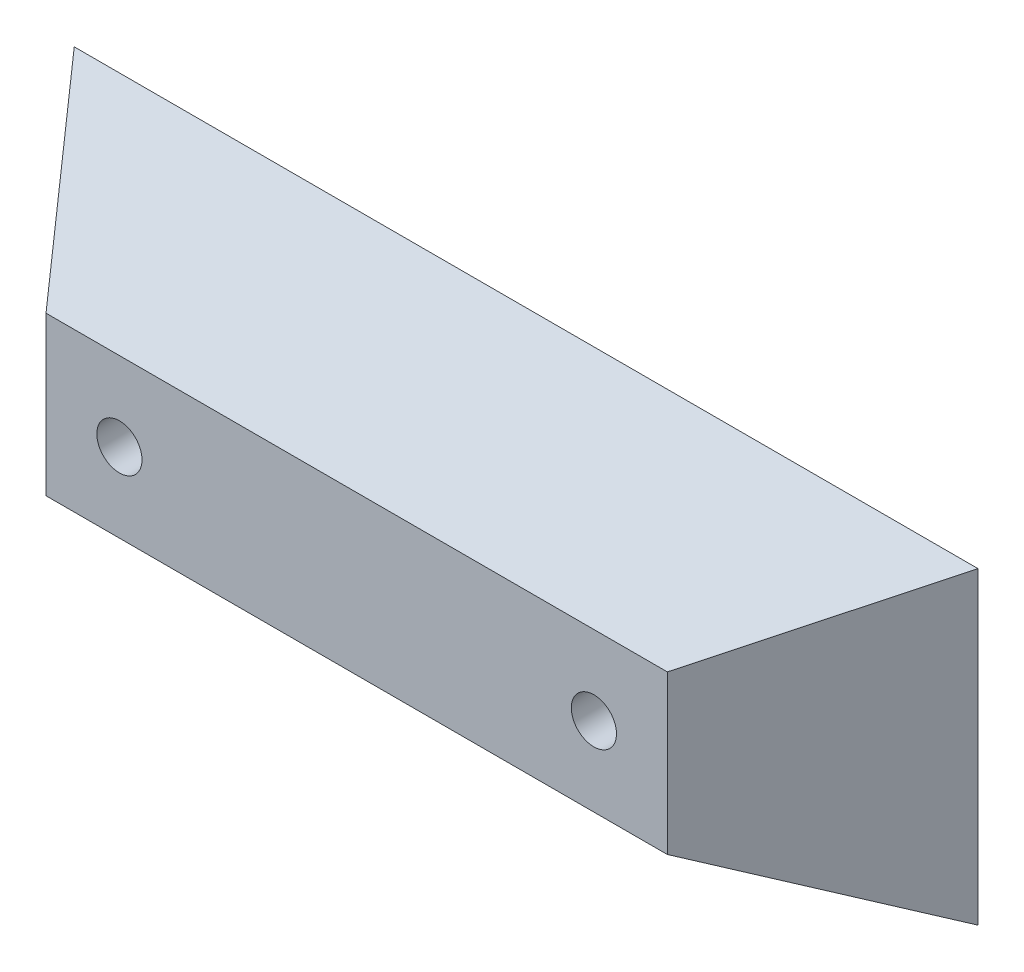
ISO-10303-21;
HEADER;
FILE_DESCRIPTION(('STEP AP214'),'2;1');
FILE_NAME('part.step','',(''),(''),'','','');
FILE_SCHEMA(('AUTOMOTIVE_DESIGN { 1 0 10303 214 1 1 1 1 }'));
ENDSEC;
DATA;
#1=APPLICATION_CONTEXT('core data for automotive mechanical design processes');
#2=APPLICATION_PROTOCOL_DEFINITION('international standard','automotive_design',2000,#1);
#3=PRODUCT_CONTEXT('',#1,'mechanical');
#4=PRODUCT('Part','Part','',(#3));
#5=PRODUCT_RELATED_PRODUCT_CATEGORY('part','',(#4));
#6=PRODUCT_DEFINITION_FORMATION('','',#4);
#7=PRODUCT_DEFINITION_CONTEXT('part definition',#1,'design');
#8=PRODUCT_DEFINITION('design','',#6,#7);
#9=PRODUCT_DEFINITION_SHAPE('','',#8);
#10=(LENGTH_UNIT() NAMED_UNIT(*) SI_UNIT(.MILLI.,.METRE.));
#11=(NAMED_UNIT(*) PLANE_ANGLE_UNIT() SI_UNIT($,.RADIAN.));
#12=(NAMED_UNIT(*) SI_UNIT($,.STERADIAN.) SOLID_ANGLE_UNIT());
#13=UNCERTAINTY_MEASURE_WITH_UNIT(LENGTH_MEASURE(1.E-05),#10,'distance_accuracy_value','');
#14=(GEOMETRIC_REPRESENTATION_CONTEXT(3) GLOBAL_UNCERTAINTY_ASSIGNED_CONTEXT((#13)) GLOBAL_UNIT_ASSIGNED_CONTEXT((#10,
#11,#12)) REPRESENTATION_CONTEXT('',''));
#15=CARTESIAN_POINT('',(0.,0.,0.));
#16=DIRECTION('',(0.,0.,1.));
#17=DIRECTION('',(1.,0.,0.));
#18=AXIS2_PLACEMENT_3D('',#15,#16,#17);
#19=CARTESIAN_POINT('',(40.,30.,0.));
#20=DIRECTION('',(0.,0.,1.));
#21=DIRECTION('',(1.,0.,0.));
#22=AXIS2_PLACEMENT_3D('',#19,#20,#21);
#23=PLANE('',#22);
#24=CARTESIAN_POINT('',(21.,15.,0.));
#25=DIRECTION('',(0.,0.,-1.));
#26=DIRECTION('',(-1.,0.,0.));
#27=AXIS2_PLACEMENT_3D('',#24,#25,#26);
#28=CIRCLE('',#27,2.);
#29=CARTESIAN_POINT('',(19.,15.,0.));
#30=VERTEX_POINT('',#29);
#31=EDGE_CURVE('E131',#30,#30,#28,.T.);
#32=ORIENTED_EDGE('',*,*,#31,.F.);
#33=EDGE_LOOP('',(#32));
#34=FACE_BOUND('',#33,.T.);
#35=CARTESIAN_POINT('',(-21.,15.,0.));
#36=DIRECTION('',(0.,0.,-1.));
#37=DIRECTION('',(-1.,0.,0.));
#38=AXIS2_PLACEMENT_3D('',#35,#36,#37);
#39=CIRCLE('',#38,2.00000000000001);
#40=CARTESIAN_POINT('',(-23.,15.,0.));
#41=VERTEX_POINT('',#40);
#42=EDGE_CURVE('E132',#41,#41,#39,.T.);
#43=ORIENTED_EDGE('',*,*,#42,.F.);
#44=EDGE_LOOP('',(#43));
#45=FACE_BOUND('',#44,.T.);
#46=DIRECTION('',(0.,-1.,0.));
#47=VECTOR('',#46,1.);
#48=CARTESIAN_POINT('',(-40.,30.,0.));
#49=LINE('',#48,#47);
#50=CARTESIAN_POINT('',(-40.,28.6666666666667,0.));
#51=VERTEX_POINT('',#50);
#52=CARTESIAN_POINT('',(-40.,1.33333333333334,0.));
#53=VERTEX_POINT('',#52);
#54=EDGE_CURVE('E103',#51,#53,#49,.T.);
#55=ORIENTED_EDGE('',*,*,#54,.F.);
#56=DIRECTION('',(1.,0.,0.));
#57=VECTOR('',#56,1.);
#58=CARTESIAN_POINT('',(0.,28.6666666666667,0.));
#59=LINE('',#58,#57);
#60=CARTESIAN_POINT('',(40.,28.6666666666667,0.));
#61=VERTEX_POINT('',#60);
#62=EDGE_CURVE('E114',#51,#61,#59,.T.);
#63=ORIENTED_EDGE('',*,*,#62,.T.);
#64=DIRECTION('',(0.,-1.,0.));
#65=VECTOR('',#64,1.);
#66=CARTESIAN_POINT('',(40.,30.,0.));
#67=LINE('',#66,#65);
#68=CARTESIAN_POINT('',(40.,1.33333333333334,0.));
#69=VERTEX_POINT('',#68);
#70=EDGE_CURVE('E88',#61,#69,#67,.T.);
#71=ORIENTED_EDGE('',*,*,#70,.T.);
#72=DIRECTION('',(1.,0.,0.));
#73=VECTOR('',#72,1.);
#74=CARTESIAN_POINT('',(-27.5,1.33333333333333,0.));
#75=LINE('',#74,#73);
#76=EDGE_CURVE('E96',#69,#53,#75,.F.);
#77=ORIENTED_EDGE('',*,*,#76,.T.);
#78=EDGE_LOOP('',(#55,#63,#71,#77));
#79=FACE_BOUND('',#78,.T.);
#80=ADVANCED_FACE('F39',(#34,#45,#79),#23,.F.);
#81=CARTESIAN_POINT('',(-40.,30.,0.));
#82=DIRECTION('',(0.768221279597376,0.,-0.64018439966448));
#83=DIRECTION('',(-0.64018439966448,0.,-0.768221279597376));
#84=AXIS2_PLACEMENT_3D('',#81,#82,#83);
#85=PLANE('',#84);
#86=DIRECTION('',(0.,-1.,0.));
#87=VECTOR('',#86,1.);
#88=CARTESIAN_POINT('',(-27.5,30.,15.));
#89=LINE('',#88,#87);
#90=CARTESIAN_POINT('',(-27.5,22.,15.));
#91=VERTEX_POINT('',#90);
#92=CARTESIAN_POINT('',(-27.5,8.,15.));
#93=VERTEX_POINT('',#92);
#94=EDGE_CURVE('E87',#91,#93,#89,.T.);
#95=ORIENTED_EDGE('',*,*,#94,.F.);
#96=DIRECTION('',(-0.605844293791514,0.323116956688808,-0.727013152549817));
#97=VECTOR('',#96,1.);
#98=CARTESIAN_POINT('',(-26.9004893964111,21.6802610114192,15.7194127243067));
#99=LINE('',#98,#97);
#100=EDGE_CURVE('E11',#91,#51,#99,.T.);
#101=ORIENTED_EDGE('',*,*,#100,.T.);
#102=ORIENTED_EDGE('',*,*,#54,.T.);
#103=DIRECTION('',(-0.605844293791514,-0.323116956688808,-0.727013152549817));
#104=VECTOR('',#103,1.);
#105=CARTESIAN_POINT('',(-27.5,8.,15.));
#106=LINE('',#105,#104);
#107=EDGE_CURVE('E111',#53,#93,#106,.F.);
#108=ORIENTED_EDGE('',*,*,#107,.T.);
#109=EDGE_LOOP('',(#95,#101,#102,#108));
#110=FACE_BOUND('',#109,.T.);
#111=ADVANCED_FACE('F120',(#110),#85,.F.);
#112=CARTESIAN_POINT('',(-27.5,30.,15.));
#113=DIRECTION('',(0.,0.,-1.));
#114=DIRECTION('',(-1.,0.,0.));
#115=AXIS2_PLACEMENT_3D('',#112,#113,#114);
#116=PLANE('',#115);
#117=CARTESIAN_POINT('',(21.,15.,15.));
#118=DIRECTION('',(0.,0.,-1.));
#119=DIRECTION('',(-1.,0.,0.));
#120=AXIS2_PLACEMENT_3D('',#117,#118,#119);
#121=CIRCLE('',#120,2.);
#122=CARTESIAN_POINT('',(19.,15.,15.));
#123=VERTEX_POINT('',#122);
#124=EDGE_CURVE('E126',#123,#123,#121,.F.);
#125=ORIENTED_EDGE('',*,*,#124,.F.);
#126=EDGE_LOOP('',(#125));
#127=FACE_BOUND('',#126,.T.);
#128=CARTESIAN_POINT('',(-21.,15.,15.));
#129=DIRECTION('',(0.,0.,-1.));
#130=DIRECTION('',(-1.,0.,0.));
#131=AXIS2_PLACEMENT_3D('',#128,#129,#130);
#132=CIRCLE('',#131,2.00000000000001);
#133=CARTESIAN_POINT('',(-23.,15.,15.));
#134=VERTEX_POINT('',#133);
#135=EDGE_CURVE('E127',#134,#134,#132,.F.);
#136=ORIENTED_EDGE('',*,*,#135,.F.);
#137=EDGE_LOOP('',(#136));
#138=FACE_BOUND('',#137,.T.);
#139=DIRECTION('',(0.,-1.,0.));
#140=VECTOR('',#139,1.);
#141=CARTESIAN_POINT('',(27.5,30.,15.));
#142=LINE('',#141,#140);
#143=CARTESIAN_POINT('',(27.5,22.,15.));
#144=VERTEX_POINT('',#143);
#145=CARTESIAN_POINT('',(27.5,8.,15.));
#146=VERTEX_POINT('',#145);
#147=EDGE_CURVE('E79',#144,#146,#142,.T.);
#148=ORIENTED_EDGE('',*,*,#147,.F.);
#149=DIRECTION('',(-1.,0.,0.));
#150=VECTOR('',#149,1.);
#151=CARTESIAN_POINT('',(-27.5,22.,15.));
#152=LINE('',#151,#150);
#153=EDGE_CURVE('E48',#144,#91,#152,.T.);
#154=ORIENTED_EDGE('',*,*,#153,.T.);
#155=ORIENTED_EDGE('',*,*,#94,.T.);
#156=DIRECTION('',(1.,0.,0.));
#157=VECTOR('',#156,1.);
#158=CARTESIAN_POINT('',(-27.5,8.,15.));
#159=LINE('',#158,#157);
#160=EDGE_CURVE('E94',#93,#146,#159,.T.);
#161=ORIENTED_EDGE('',*,*,#160,.T.);
#162=EDGE_LOOP('',(#148,#154,#155,#161));
#163=FACE_BOUND('',#162,.T.);
#164=ADVANCED_FACE('F99',(#127,#138,#163),#116,.F.);
#165=CARTESIAN_POINT('',(27.5,30.,15.));
#166=DIRECTION('',(-0.768221279597376,0.,-0.64018439966448));
#167=DIRECTION('',(-0.64018439966448,0.,0.768221279597376));
#168=AXIS2_PLACEMENT_3D('',#165,#166,#167);
#169=PLANE('',#168);
#170=ORIENTED_EDGE('',*,*,#70,.F.);
#171=DIRECTION('',(-0.605844293791514,-0.323116956688808,0.727013152549817));
#172=VECTOR('',#171,1.);
#173=CARTESIAN_POINT('',(26.9004893964111,21.6802610114193,15.7194127243067));
#174=LINE('',#173,#172);
#175=EDGE_CURVE('E61',#61,#144,#174,.T.);
#176=ORIENTED_EDGE('',*,*,#175,.T.);
#177=ORIENTED_EDGE('',*,*,#147,.T.);
#178=DIRECTION('',(-0.605844293791514,0.323116956688808,0.727013152549817));
#179=VECTOR('',#178,1.);
#180=CARTESIAN_POINT('',(7.31239804241436,18.7667210440457,39.2251223491028));
#181=LINE('',#180,#179);
#182=EDGE_CURVE('E82',#146,#69,#181,.F.);
#183=ORIENTED_EDGE('',*,*,#182,.T.);
#184=EDGE_LOOP('',(#170,#176,#177,#183));
#185=FACE_BOUND('',#184,.T.);
#186=ADVANCED_FACE('F81',(#185),#169,.F.);
#187=CARTESIAN_POINT('',(-21.,15.,15.001));
#188=DIRECTION('',(0.,0.,-1.));
#189=DIRECTION('',(-1.,0.,0.));
#190=AXIS2_PLACEMENT_3D('',#187,#188,#189);
#191=CYLINDRICAL_SURFACE('',#190,2.00000000000001);
#192=CARTESIAN_POINT('',(-23.,15.,0.));
#193=CARTESIAN_POINT('',(-23.,15.,0.15625));
#194=CARTESIAN_POINT('',(-23.,15.,0.3125));
#195=CARTESIAN_POINT('',(-23.,15.,0.625000000000001));
#196=CARTESIAN_POINT('',(-23.,15.,0.781250000000001));
#197=CARTESIAN_POINT('',(-23.,15.,1.09375));
#198=CARTESIAN_POINT('',(-23.,15.,1.25));
#199=CARTESIAN_POINT('',(-23.,15.,1.5625));
#200=CARTESIAN_POINT('',(-23.,15.,1.71875));
#201=CARTESIAN_POINT('',(-23.,15.,2.03125));
#202=CARTESIAN_POINT('',(-23.,15.,2.1875));
#203=CARTESIAN_POINT('',(-23.,15.,2.5));
#204=CARTESIAN_POINT('',(-23.,15.,2.65625));
#205=CARTESIAN_POINT('',(-23.,15.,2.96875));
#206=CARTESIAN_POINT('',(-23.,15.,3.125));
#207=CARTESIAN_POINT('',(-23.,15.,3.4375));
#208=CARTESIAN_POINT('',(-23.,15.,3.59375));
#209=CARTESIAN_POINT('',(-23.,15.,3.90625));
#210=CARTESIAN_POINT('',(-23.,15.,4.0625));
#211=CARTESIAN_POINT('',(-23.,15.,4.375));
#212=CARTESIAN_POINT('',(-23.,15.,4.53125));
#213=CARTESIAN_POINT('',(-23.,15.,4.84375));
#214=CARTESIAN_POINT('',(-23.,15.,5.));
#215=CARTESIAN_POINT('',(-23.,15.,5.3125));
#216=CARTESIAN_POINT('',(-23.,15.,5.46875));
#217=CARTESIAN_POINT('',(-23.,15.,5.78125));
#218=CARTESIAN_POINT('',(-23.,15.,5.9375));
#219=CARTESIAN_POINT('',(-23.,15.,6.25));
#220=CARTESIAN_POINT('',(-23.,15.,6.40625));
#221=CARTESIAN_POINT('',(-23.,15.,6.71875));
#222=CARTESIAN_POINT('',(-23.,15.,6.875));
#223=CARTESIAN_POINT('',(-23.,15.,7.1875));
#224=CARTESIAN_POINT('',(-23.,15.,7.34375));
#225=CARTESIAN_POINT('',(-23.,15.,7.65625));
#226=CARTESIAN_POINT('',(-23.,15.,7.8125));
#227=CARTESIAN_POINT('',(-23.,15.,8.125));
#228=CARTESIAN_POINT('',(-23.,15.,8.28125));
#229=CARTESIAN_POINT('',(-23.,15.,8.59375));
#230=CARTESIAN_POINT('',(-23.,15.,8.75));
#231=CARTESIAN_POINT('',(-23.,15.,9.0625));
#232=CARTESIAN_POINT('',(-23.,15.,9.21875));
#233=CARTESIAN_POINT('',(-23.,15.,9.53125));
#234=CARTESIAN_POINT('',(-23.,15.,9.6875));
#235=CARTESIAN_POINT('',(-23.,15.,10.));
#236=CARTESIAN_POINT('',(-23.,15.,10.15625));
#237=CARTESIAN_POINT('',(-23.,15.,10.46875));
#238=CARTESIAN_POINT('',(-23.,15.,10.625));
#239=CARTESIAN_POINT('',(-23.,15.,10.9375));
#240=CARTESIAN_POINT('',(-23.,15.,11.09375));
#241=CARTESIAN_POINT('',(-23.,15.,11.40625));
#242=CARTESIAN_POINT('',(-23.,15.,11.5625));
#243=CARTESIAN_POINT('',(-23.,15.,11.875));
#244=CARTESIAN_POINT('',(-23.,15.,12.03125));
#245=CARTESIAN_POINT('',(-23.,15.,12.34375));
#246=CARTESIAN_POINT('',(-23.,15.,12.5));
#247=CARTESIAN_POINT('',(-23.,15.,12.8125));
#248=CARTESIAN_POINT('',(-23.,15.,12.96875));
#249=CARTESIAN_POINT('',(-23.,15.,13.28125));
#250=CARTESIAN_POINT('',(-23.,15.,13.4375));
#251=CARTESIAN_POINT('',(-23.,15.,13.75));
#252=CARTESIAN_POINT('',(-23.,15.,13.90625));
#253=CARTESIAN_POINT('',(-23.,15.,14.21875));
#254=CARTESIAN_POINT('',(-23.,15.,14.375));
#255=CARTESIAN_POINT('',(-23.,15.,14.6875));
#256=CARTESIAN_POINT('',(-23.,15.,14.84375));
#257=CARTESIAN_POINT('',(-23.,15.,15.));
#258=B_SPLINE_CURVE_WITH_KNOTS('',3,(#192,#193,#194,#195,#196,#197,#198,#199,#200,#201,#202,
#203,#204,#205,#206,#207,#208,#209,#210,#211,#212,#213,#214,#215,#216,#217,#218,#219,#220,#221,
#222,#223,#224,#225,#226,#227,#228,#229,#230,#231,#232,#233,#234,#235,#236,#237,#238,#239,#240,
#241,#242,#243,#244,#245,#246,#247,#248,#249,#250,#251,#252,#253,#254,#255,#256,#257),
.UNSPECIFIED.,.F.,.F.,(4,2,2,2,2,2,2,2,2,2,2,2,2,2,2,2,2,2,2,2,2,2,2,2,2,2,2,2,2,2,2,2,4),(0.,
0.46875,0.937500000000001,1.40625,1.875,2.34375,2.8125,3.28125,3.75,4.21875,4.6875,5.15625,
5.625,6.09375,6.5625,7.03125,7.5,7.96875,8.4375,8.90625,9.375,9.84375,10.3125,10.78125,11.25,
11.71875,12.1875,12.65625,13.125,13.59375,14.0625,14.53125,15.),.UNSPECIFIED.);
#259=EDGE_CURVE('BSEAM158',#41,#134,#258,.T.);
#260=ORIENTED_EDGE('',*,*,#42,.T.);
#261=ORIENTED_EDGE('',*,*,#135,.T.);
#262=ORIENTED_EDGE('',*,*,#259,.T.);
#263=ORIENTED_EDGE('',*,*,#259,.F.);
#264=EDGE_LOOP('',(#260,#262,#261,#263));
#265=FACE_BOUND('',#264,.T.);
#266=ADVANCED_FACE('F158',(#265),#191,.F.);
#267=CARTESIAN_POINT('',(21.,15.,15.001));
#268=DIRECTION('',(0.,0.,-1.));
#269=DIRECTION('',(-1.,0.,0.));
#270=AXIS2_PLACEMENT_3D('',#267,#268,#269);
#271=CYLINDRICAL_SURFACE('',#270,2.);
#272=CARTESIAN_POINT('',(19.,15.,0.));
#273=CARTESIAN_POINT('',(19.,15.,0.15625));
#274=CARTESIAN_POINT('',(19.,15.,0.3125));
#275=CARTESIAN_POINT('',(19.,15.,0.625000000000001));
#276=CARTESIAN_POINT('',(19.,15.,0.781250000000001));
#277=CARTESIAN_POINT('',(19.,15.,1.09375));
#278=CARTESIAN_POINT('',(19.,15.,1.25));
#279=CARTESIAN_POINT('',(19.,15.,1.5625));
#280=CARTESIAN_POINT('',(19.,15.,1.71875));
#281=CARTESIAN_POINT('',(19.,15.,2.03125));
#282=CARTESIAN_POINT('',(19.,15.,2.1875));
#283=CARTESIAN_POINT('',(19.,15.,2.5));
#284=CARTESIAN_POINT('',(19.,15.,2.65625));
#285=CARTESIAN_POINT('',(19.,15.,2.96875));
#286=CARTESIAN_POINT('',(19.,15.,3.125));
#287=CARTESIAN_POINT('',(19.,15.,3.4375));
#288=CARTESIAN_POINT('',(19.,15.,3.59375));
#289=CARTESIAN_POINT('',(19.,15.,3.90625));
#290=CARTESIAN_POINT('',(19.,15.,4.0625));
#291=CARTESIAN_POINT('',(19.,15.,4.375));
#292=CARTESIAN_POINT('',(19.,15.,4.53125));
#293=CARTESIAN_POINT('',(19.,15.,4.84375));
#294=CARTESIAN_POINT('',(19.,15.,5.));
#295=CARTESIAN_POINT('',(19.,15.,5.3125));
#296=CARTESIAN_POINT('',(19.,15.,5.46875));
#297=CARTESIAN_POINT('',(19.,15.,5.78125));
#298=CARTESIAN_POINT('',(19.,15.,5.9375));
#299=CARTESIAN_POINT('',(19.,15.,6.25));
#300=CARTESIAN_POINT('',(19.,15.,6.40625));
#301=CARTESIAN_POINT('',(19.,15.,6.71875));
#302=CARTESIAN_POINT('',(19.,15.,6.875));
#303=CARTESIAN_POINT('',(19.,15.,7.1875));
#304=CARTESIAN_POINT('',(19.,15.,7.34375));
#305=CARTESIAN_POINT('',(19.,15.,7.65625));
#306=CARTESIAN_POINT('',(19.,15.,7.8125));
#307=CARTESIAN_POINT('',(19.,15.,8.125));
#308=CARTESIAN_POINT('',(19.,15.,8.28125));
#309=CARTESIAN_POINT('',(19.,15.,8.59375));
#310=CARTESIAN_POINT('',(19.,15.,8.75));
#311=CARTESIAN_POINT('',(19.,15.,9.0625));
#312=CARTESIAN_POINT('',(19.,15.,9.21875));
#313=CARTESIAN_POINT('',(19.,15.,9.53125));
#314=CARTESIAN_POINT('',(19.,15.,9.6875));
#315=CARTESIAN_POINT('',(19.,15.,10.));
#316=CARTESIAN_POINT('',(19.,15.,10.15625));
#317=CARTESIAN_POINT('',(19.,15.,10.46875));
#318=CARTESIAN_POINT('',(19.,15.,10.625));
#319=CARTESIAN_POINT('',(19.,15.,10.9375));
#320=CARTESIAN_POINT('',(19.,15.,11.09375));
#321=CARTESIAN_POINT('',(19.,15.,11.40625));
#322=CARTESIAN_POINT('',(19.,15.,11.5625));
#323=CARTESIAN_POINT('',(19.,15.,11.875));
#324=CARTESIAN_POINT('',(19.,15.,12.03125));
#325=CARTESIAN_POINT('',(19.,15.,12.34375));
#326=CARTESIAN_POINT('',(19.,15.,12.5));
#327=CARTESIAN_POINT('',(19.,15.,12.8125));
#328=CARTESIAN_POINT('',(19.,15.,12.96875));
#329=CARTESIAN_POINT('',(19.,15.,13.28125));
#330=CARTESIAN_POINT('',(19.,15.,13.4375));
#331=CARTESIAN_POINT('',(19.,15.,13.75));
#332=CARTESIAN_POINT('',(19.,15.,13.90625));
#333=CARTESIAN_POINT('',(19.,15.,14.21875));
#334=CARTESIAN_POINT('',(19.,15.,14.375));
#335=CARTESIAN_POINT('',(19.,15.,14.6875));
#336=CARTESIAN_POINT('',(19.,15.,14.84375));
#337=CARTESIAN_POINT('',(19.,15.,15.));
#338=B_SPLINE_CURVE_WITH_KNOTS('',3,(#272,#273,#274,#275,#276,#277,#278,#279,#280,#281,#282,
#283,#284,#285,#286,#287,#288,#289,#290,#291,#292,#293,#294,#295,#296,#297,#298,#299,#300,#301,
#302,#303,#304,#305,#306,#307,#308,#309,#310,#311,#312,#313,#314,#315,#316,#317,#318,#319,#320,
#321,#322,#323,#324,#325,#326,#327,#328,#329,#330,#331,#332,#333,#334,#335,#336,#337),
.UNSPECIFIED.,.F.,.F.,(4,2,2,2,2,2,2,2,2,2,2,2,2,2,2,2,2,2,2,2,2,2,2,2,2,2,2,2,2,2,2,2,4),(0.,
0.46875,0.937500000000001,1.40625,1.875,2.34375,2.8125,3.28125,3.75,4.21875,4.6875,5.15625,
5.625,6.09375,6.5625,7.03125,7.5,7.96875,8.4375,8.90625,9.375,9.84375,10.3125,10.78125,11.25,
11.71875,12.1875,12.65625,13.125,13.59375,14.0625,14.53125,15.),.UNSPECIFIED.);
#339=EDGE_CURVE('BSEAM143',#30,#123,#338,.T.);
#340=ORIENTED_EDGE('',*,*,#31,.T.);
#341=ORIENTED_EDGE('',*,*,#124,.T.);
#342=ORIENTED_EDGE('',*,*,#339,.T.);
#343=ORIENTED_EDGE('',*,*,#339,.F.);
#344=EDGE_LOOP('',(#340,#342,#341,#343));
#345=FACE_BOUND('',#344,.T.);
#346=ADVANCED_FACE('F143',(#345),#271,.F.);
#347=CARTESIAN_POINT('',(-27.5,8.,15.));
#348=DIRECTION('',(0.,0.913811548620257,-0.406138466053448));
#349=DIRECTION('',(1.,0.,0.));
#350=AXIS2_PLACEMENT_3D('',#347,#348,#349);
#351=PLANE('',#350);
#352=ORIENTED_EDGE('',*,*,#107,.F.);
#353=ORIENTED_EDGE('',*,*,#76,.F.);
#354=ORIENTED_EDGE('',*,*,#182,.F.);
#355=ORIENTED_EDGE('',*,*,#160,.F.);
#356=EDGE_LOOP('',(#352,#353,#354,#355));
#357=FACE_BOUND('',#356,.T.);
#358=ADVANCED_FACE('F93',(#357),#351,.F.);
#359=CARTESIAN_POINT('',(0.,30.,-3.));
#360=DIRECTION('',(0.,0.913811548620257,0.406138466053448));
#361=DIRECTION('',(-1.,0.,0.));
#362=AXIS2_PLACEMENT_3D('',#359,#360,#361);
#363=PLANE('',#362);
#364=ORIENTED_EDGE('',*,*,#100,.F.);
#365=ORIENTED_EDGE('',*,*,#153,.F.);
#366=ORIENTED_EDGE('',*,*,#175,.F.);
#367=ORIENTED_EDGE('',*,*,#62,.F.);
#368=EDGE_LOOP('',(#364,#365,#366,#367));
#369=FACE_BOUND('',#368,.T.);
#370=ADVANCED_FACE('F41',(#369),#363,.T.);
#371=CLOSED_SHELL('',(#80,#111,#164,#186,#266,#346,#358,#370));
#372=MANIFOLD_SOLID_BREP('B2',#371);
#373=ADVANCED_BREP_SHAPE_REPRESENTATION('',(#18,#372),#14);
#374=SHAPE_DEFINITION_REPRESENTATION(#9,#373);
ENDSEC;
END-ISO-10303-21;
